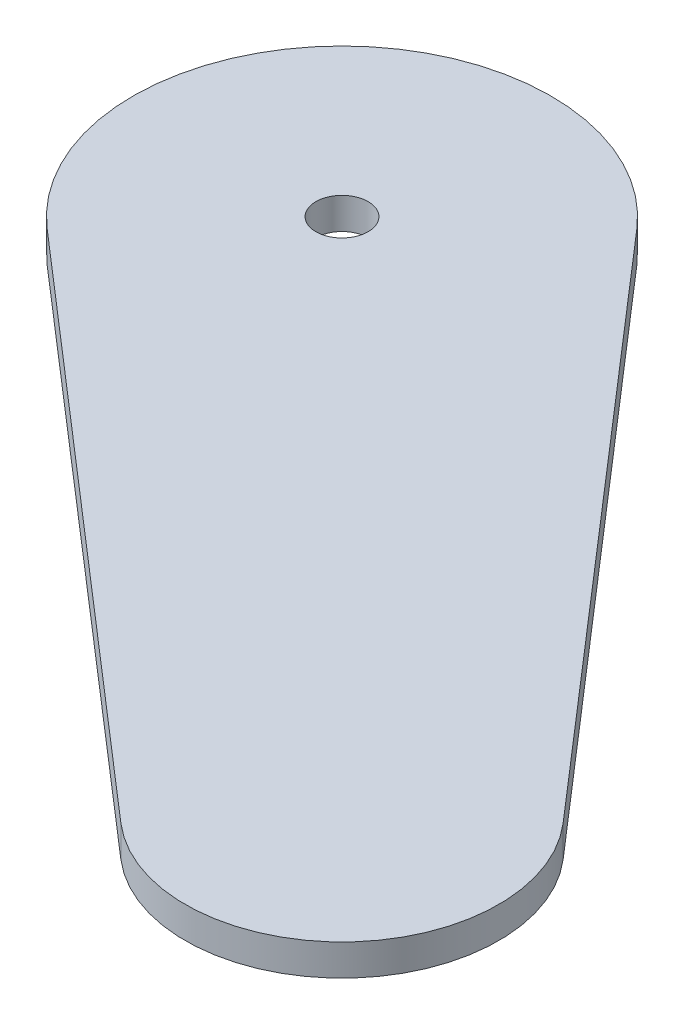
ISO-10303-21;
HEADER;
FILE_DESCRIPTION(('STEP AP214'),'2;1');
FILE_NAME('part.step','',(''),(''),'','','');
FILE_SCHEMA(('AUTOMOTIVE_DESIGN { 1 0 10303 214 1 1 1 1 }'));
ENDSEC;
DATA;
#1=APPLICATION_CONTEXT('core data for automotive mechanical design processes');
#2=APPLICATION_PROTOCOL_DEFINITION('international standard','automotive_design',2000,#1);
#3=PRODUCT_CONTEXT('',#1,'mechanical');
#4=PRODUCT('Part','Part','',(#3));
#5=PRODUCT_RELATED_PRODUCT_CATEGORY('part','',(#4));
#6=PRODUCT_DEFINITION_FORMATION('','',#4);
#7=PRODUCT_DEFINITION_CONTEXT('part definition',#1,'design');
#8=PRODUCT_DEFINITION('design','',#6,#7);
#9=PRODUCT_DEFINITION_SHAPE('','',#8);
#10=(LENGTH_UNIT() NAMED_UNIT(*) SI_UNIT(.MILLI.,.METRE.));
#11=(NAMED_UNIT(*) PLANE_ANGLE_UNIT() SI_UNIT($,.RADIAN.));
#12=(NAMED_UNIT(*) SI_UNIT($,.STERADIAN.) SOLID_ANGLE_UNIT());
#13=UNCERTAINTY_MEASURE_WITH_UNIT(LENGTH_MEASURE(1.E-05),#10,'distance_accuracy_value','');
#14=(GEOMETRIC_REPRESENTATION_CONTEXT(3) GLOBAL_UNCERTAINTY_ASSIGNED_CONTEXT((#13)) GLOBAL_UNIT_ASSIGNED_CONTEXT((#10,
#11,#12)) REPRESENTATION_CONTEXT('',''));
#15=CARTESIAN_POINT('',(0.,0.,0.));
#16=DIRECTION('',(0.,0.,1.));
#17=DIRECTION('',(1.,0.,0.));
#18=AXIS2_PLACEMENT_3D('',#15,#16,#17);
#19=CARTESIAN_POINT('',(0.,3.,0.));
#20=DIRECTION('',(0.,-1.,0.));
#21=DIRECTION('',(0.,0.,-1.));
#22=AXIS2_PLACEMENT_3D('',#19,#20,#21);
#23=CYLINDRICAL_SURFACE('',#22,20.);
#24=CARTESIAN_POINT('',(0.,0.,0.));
#25=DIRECTION('',(0.,1.,0.));
#26=DIRECTION('',(0.,0.,1.));
#27=AXIS2_PLACEMENT_3D('',#24,#25,#26);
#28=CIRCLE('',#27,20.);
#29=CARTESIAN_POINT('',(15.1161651575033,0.,-13.0958600683989));
#30=VERTEX_POINT('',#29);
#31=CARTESIAN_POINT('',(-13.0958600683989,0.,15.1161651575033));
#32=VERTEX_POINT('',#31);
#33=EDGE_CURVE('E115',#30,#32,#28,.T.);
#34=ORIENTED_EDGE('',*,*,#33,.T.);
#35=DIRECTION('',(0.,-1.,0.));
#36=VECTOR('',#35,1.);
#37=CARTESIAN_POINT('',(-13.0958600683989,3.,15.1161651575033));
#38=LINE('',#37,#36);
#39=CARTESIAN_POINT('',(-13.0958600683989,3.,15.1161651575033));
#40=VERTEX_POINT('',#39);
#41=EDGE_CURVE('E11',#40,#32,#38,.T.);
#42=ORIENTED_EDGE('',*,*,#41,.F.);
#43=CARTESIAN_POINT('',(0.,3.,0.));
#44=DIRECTION('',(0.,1.,0.));
#45=DIRECTION('',(0.,0.,1.));
#46=AXIS2_PLACEMENT_3D('',#43,#44,#45);
#47=CIRCLE('',#46,20.);
#48=CARTESIAN_POINT('',(15.1161651575033,3.,-13.0958600683989));
#49=VERTEX_POINT('',#48);
#50=EDGE_CURVE('E97',#49,#40,#47,.T.);
#51=ORIENTED_EDGE('',*,*,#50,.F.);
#52=DIRECTION('',(0.,-1.,0.));
#53=VECTOR('',#52,1.);
#54=CARTESIAN_POINT('',(15.1161651575033,3.,-13.0958600683989));
#55=LINE('',#54,#53);
#56=EDGE_CURVE('E64',#49,#30,#55,.T.);
#57=ORIENTED_EDGE('',*,*,#56,.T.);
#58=EDGE_LOOP('',(#34,#42,#51,#57));
#59=FACE_BOUND('',#58,.T.);
#60=ADVANCED_FACE('F47',(#59),#23,.T.);
#61=CARTESIAN_POINT('',(-13.0958600683989,3.,15.1161651575033));
#62=DIRECTION('',(0.654793003419943,0.,-0.755808257875164));
#63=DIRECTION('',(-0.755808257875164,0.,-0.654793003419943));
#64=AXIS2_PLACEMENT_3D('',#61,#62,#63);
#65=PLANE('',#64);
#66=DIRECTION('',(0.755808257875164,0.,0.654793003419943));
#67=VECTOR('',#66,1.);
#68=CARTESIAN_POINT('',(-13.0958600683989,0.,15.1161651575033));
#69=LINE('',#68,#67);
#70=CARTESIAN_POINT('',(39.6755796317592,0.,60.8345985511858));
#71=VERTEX_POINT('',#70);
#72=EDGE_CURVE('E103',#32,#71,#69,.T.);
#73=ORIENTED_EDGE('',*,*,#72,.T.);
#74=DIRECTION('',(0.,-1.,0.));
#75=VECTOR('',#74,1.);
#76=CARTESIAN_POINT('',(39.6755796317592,3.,60.8345985511858));
#77=LINE('',#76,#75);
#78=CARTESIAN_POINT('',(39.6755796317592,3.,60.8345985511858));
#79=VERTEX_POINT('',#78);
#80=EDGE_CURVE('E56',#79,#71,#77,.T.);
#81=ORIENTED_EDGE('',*,*,#80,.F.);
#82=DIRECTION('',(0.755808257875164,0.,0.654793003419943));
#83=VECTOR('',#82,1.);
#84=CARTESIAN_POINT('',(-13.0958600683989,3.,15.1161651575033));
#85=LINE('',#84,#83);
#86=EDGE_CURVE('E90',#40,#79,#85,.T.);
#87=ORIENTED_EDGE('',*,*,#86,.F.);
#88=ORIENTED_EDGE('',*,*,#41,.T.);
#89=EDGE_LOOP('',(#73,#81,#87,#88));
#90=FACE_BOUND('',#89,.T.);
#91=ADVANCED_FACE('F102',(#90),#65,.F.);
#92=CARTESIAN_POINT('',(49.4974746830583,3.,49.4974746830583));
#93=DIRECTION('',(0.,-1.,0.));
#94=DIRECTION('',(0.,0.,-1.));
#95=AXIS2_PLACEMENT_3D('',#92,#93,#94);
#96=CYLINDRICAL_SURFACE('',#95,15.);
#97=CARTESIAN_POINT('',(49.4974746830583,0.,49.4974746830583));
#98=DIRECTION('',(0.,1.,0.));
#99=DIRECTION('',(0.,0.,1.));
#100=AXIS2_PLACEMENT_3D('',#97,#98,#99);
#101=CIRCLE('',#100,15.);
#102=CARTESIAN_POINT('',(60.8345985511858,0.,39.6755796317592));
#103=VERTEX_POINT('',#102);
#104=EDGE_CURVE('E121',#71,#103,#101,.T.);
#105=ORIENTED_EDGE('',*,*,#104,.T.);
#106=DIRECTION('',(0.,-1.,0.));
#107=VECTOR('',#106,1.);
#108=CARTESIAN_POINT('',(60.8345985511858,3.,39.6755796317592));
#109=LINE('',#108,#107);
#110=CARTESIAN_POINT('',(60.8345985511858,3.,39.6755796317592));
#111=VERTEX_POINT('',#110);
#112=EDGE_CURVE('E79',#111,#103,#109,.T.);
#113=ORIENTED_EDGE('',*,*,#112,.F.);
#114=CARTESIAN_POINT('',(49.4974746830583,3.,49.4974746830583));
#115=DIRECTION('',(0.,1.,0.));
#116=DIRECTION('',(0.,0.,1.));
#117=AXIS2_PLACEMENT_3D('',#114,#115,#116);
#118=CIRCLE('',#117,15.);
#119=EDGE_CURVE('E96',#79,#111,#118,.T.);
#120=ORIENTED_EDGE('',*,*,#119,.F.);
#121=ORIENTED_EDGE('',*,*,#80,.T.);
#122=EDGE_LOOP('',(#105,#113,#120,#121));
#123=FACE_BOUND('',#122,.T.);
#124=ADVANCED_FACE('F107',(#123),#96,.T.);
#125=CARTESIAN_POINT('',(15.1161651575033,3.,-13.0958600683989));
#126=DIRECTION('',(0.755808257875164,0.,-0.654793003419943));
#127=DIRECTION('',(-0.654793003419943,0.,-0.755808257875164));
#128=AXIS2_PLACEMENT_3D('',#125,#126,#127);
#129=PLANE('',#128);
#130=DIRECTION('',(0.654793003419943,0.,0.755808257875164));
#131=VECTOR('',#130,1.);
#132=CARTESIAN_POINT('',(15.1161651575033,0.,-13.0958600683989));
#133=LINE('',#132,#131);
#134=EDGE_CURVE('E124',#30,#103,#133,.T.);
#135=ORIENTED_EDGE('',*,*,#134,.F.);
#136=ORIENTED_EDGE('',*,*,#56,.F.);
#137=DIRECTION('',(0.654793003419943,0.,0.755808257875164));
#138=VECTOR('',#137,1.);
#139=CARTESIAN_POINT('',(15.1161651575033,3.,-13.0958600683989));
#140=LINE('',#139,#138);
#141=EDGE_CURVE('E109',#49,#111,#140,.T.);
#142=ORIENTED_EDGE('',*,*,#141,.T.);
#143=ORIENTED_EDGE('',*,*,#112,.T.);
#144=EDGE_LOOP('',(#135,#136,#142,#143));
#145=FACE_BOUND('',#144,.T.);
#146=ADVANCED_FACE('F151',(#145),#129,.T.);
#147=CARTESIAN_POINT('',(0.,3.,0.));
#148=DIRECTION('',(0.,1.,0.));
#149=DIRECTION('',(0.,0.,1.));
#150=AXIS2_PLACEMENT_3D('',#147,#148,#149);
#151=PLANE('',#150);
#152=CARTESIAN_POINT('',(0.,3.,0.));
#153=DIRECTION('',(0.,1.,0.));
#154=DIRECTION('',(0.,0.,1.));
#155=AXIS2_PLACEMENT_3D('',#152,#153,#154);
#156=CIRCLE('',#155,2.5);
#157=CARTESIAN_POINT('',(0.,3.,2.5));
#158=VERTEX_POINT('',#157);
#159=EDGE_CURVE('E134',#158,#158,#156,.T.);
#160=ORIENTED_EDGE('',*,*,#159,.F.);
#161=EDGE_LOOP('',(#160));
#162=FACE_BOUND('',#161,.T.);
#163=ORIENTED_EDGE('',*,*,#50,.T.);
#164=ORIENTED_EDGE('',*,*,#86,.T.);
#165=ORIENTED_EDGE('',*,*,#119,.T.);
#166=ORIENTED_EDGE('',*,*,#141,.F.);
#167=EDGE_LOOP('',(#163,#164,#165,#166));
#168=FACE_BOUND('',#167,.T.);
#169=ADVANCED_FACE('F93',(#162,#168),#151,.T.);
#170=CARTESIAN_POINT('',(0.,0.,0.));
#171=DIRECTION('',(0.,1.,0.));
#172=DIRECTION('',(0.,0.,1.));
#173=AXIS2_PLACEMENT_3D('',#170,#171,#172);
#174=PLANE('',#173);
#175=CARTESIAN_POINT('',(0.,0.,0.));
#176=DIRECTION('',(0.,1.,0.));
#177=DIRECTION('',(0.,0.,1.));
#178=AXIS2_PLACEMENT_3D('',#175,#176,#177);
#179=CIRCLE('',#178,2.5);
#180=CARTESIAN_POINT('',(0.,0.,2.5));
#181=VERTEX_POINT('',#180);
#182=EDGE_CURVE('E118',#181,#181,#179,.T.);
#183=ORIENTED_EDGE('',*,*,#182,.T.);
#184=EDGE_LOOP('',(#183));
#185=FACE_BOUND('',#184,.T.);
#186=ORIENTED_EDGE('',*,*,#33,.F.);
#187=ORIENTED_EDGE('',*,*,#134,.T.);
#188=ORIENTED_EDGE('',*,*,#104,.F.);
#189=ORIENTED_EDGE('',*,*,#72,.F.);
#190=EDGE_LOOP('',(#186,#187,#188,#189));
#191=FACE_BOUND('',#190,.T.);
#192=ADVANCED_FACE('F142',(#185,#191),#174,.F.);
#193=CARTESIAN_POINT('',(0.,0.,0.));
#194=DIRECTION('',(0.,1.,0.));
#195=DIRECTION('',(0.,0.,1.));
#196=AXIS2_PLACEMENT_3D('',#193,#194,#195);
#197=CYLINDRICAL_SURFACE('',#196,2.5);
#198=ORIENTED_EDGE('',*,*,#182,.F.);
#199=EDGE_LOOP('',(#198));
#200=FACE_BOUND('',#199,.T.);
#201=ORIENTED_EDGE('',*,*,#159,.T.);
#202=EDGE_LOOP('',(#201));
#203=FACE_BOUND('',#202,.T.);
#204=ADVANCED_FACE('F144',(#200,#203),#197,.F.);
#205=CLOSED_SHELL('',(#60,#91,#124,#146,#169,#192,#204));
#206=MANIFOLD_SOLID_BREP('B2',#205);
#207=ADVANCED_BREP_SHAPE_REPRESENTATION('',(#18,#206),#14);
#208=SHAPE_DEFINITION_REPRESENTATION(#9,#207);
ENDSEC;
END-ISO-10303-21;
